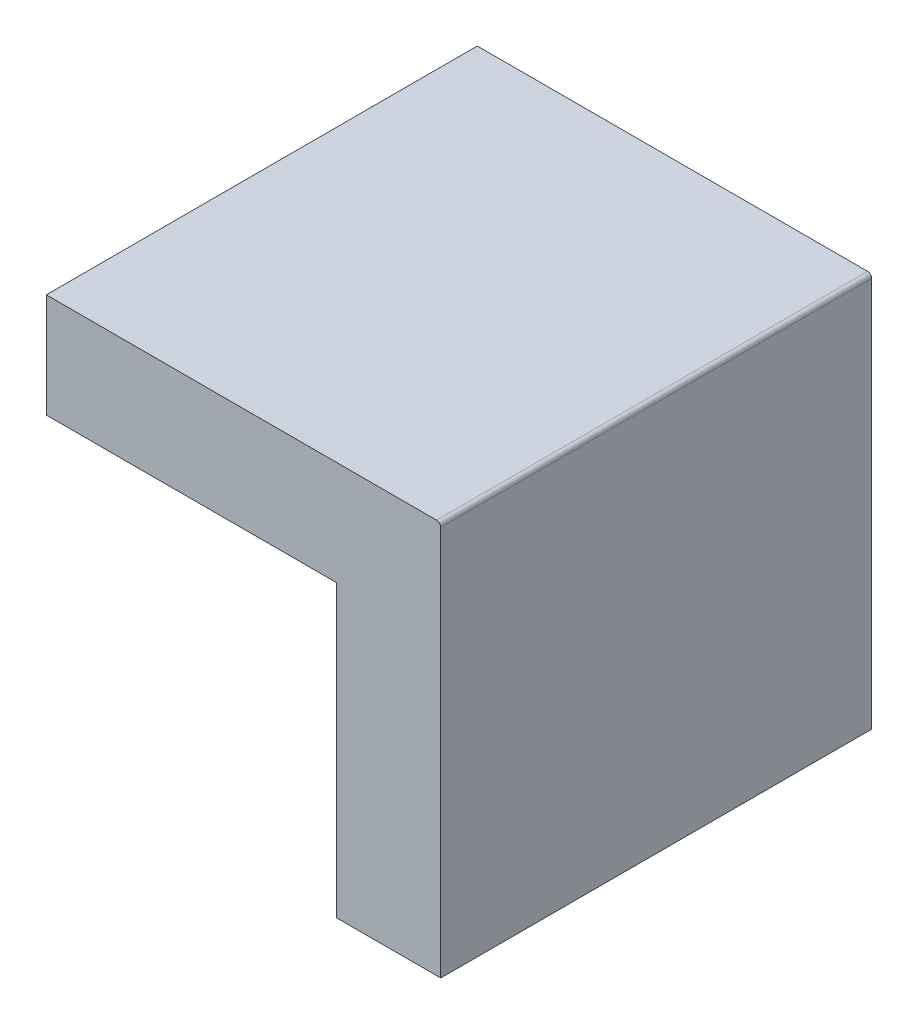
ISO-10303-21;
HEADER;
FILE_DESCRIPTION(('STEP AP214'),'2;1');
FILE_NAME('part.step','',(''),(''),'','','');
FILE_SCHEMA(('AUTOMOTIVE_DESIGN { 1 0 10303 214 1 1 1 1 }'));
ENDSEC;
DATA;
#1=APPLICATION_CONTEXT('core data for automotive mechanical design processes');
#2=APPLICATION_PROTOCOL_DEFINITION('international standard','automotive_design',2000,#1);
#3=PRODUCT_CONTEXT('',#1,'mechanical');
#4=PRODUCT('Part','Part','',(#3));
#5=PRODUCT_RELATED_PRODUCT_CATEGORY('part','',(#4));
#6=PRODUCT_DEFINITION_FORMATION('','',#4);
#7=PRODUCT_DEFINITION_CONTEXT('part definition',#1,'design');
#8=PRODUCT_DEFINITION('design','',#6,#7);
#9=PRODUCT_DEFINITION_SHAPE('','',#8);
#10=(LENGTH_UNIT() NAMED_UNIT(*) SI_UNIT(.MILLI.,.METRE.));
#11=(NAMED_UNIT(*) PLANE_ANGLE_UNIT() SI_UNIT($,.RADIAN.));
#12=(NAMED_UNIT(*) SI_UNIT($,.STERADIAN.) SOLID_ANGLE_UNIT());
#13=UNCERTAINTY_MEASURE_WITH_UNIT(LENGTH_MEASURE(1.E-05),#10,'distance_accuracy_value','');
#14=(GEOMETRIC_REPRESENTATION_CONTEXT(3) GLOBAL_UNCERTAINTY_ASSIGNED_CONTEXT((#13)) GLOBAL_UNIT_ASSIGNED_CONTEXT((#10,
#11,#12)) REPRESENTATION_CONTEXT('',''));
#15=CARTESIAN_POINT('',(0.,0.,0.));
#16=DIRECTION('',(0.,0.,1.));
#17=DIRECTION('',(1.,0.,0.));
#18=AXIS2_PLACEMENT_3D('',#15,#16,#17);
#19=CARTESIAN_POINT('',(-9.52499999998822,-9.52500000000975,-2316.22726561557));
#20=DIRECTION('',(0.,0.,1.));
#21=DIRECTION('',(1.,0.,0.));
#22=AXIS2_PLACEMENT_3D('',#19,#20,#21);
#23=CYLINDRICAL_SURFACE('',#22,9.52499999999417);
#24=CARTESIAN_POINT('',(-9.52499999998822,-9.52500000000975,-704.800000000001));
#25=DIRECTION('',(0.,0.,1.));
#26=DIRECTION('',(1.,0.,0.));
#27=AXIS2_PLACEMENT_3D('',#24,#25,#26);
#28=CIRCLE('',#27,9.52499999999417);
#29=CARTESIAN_POINT('',(-9.52499999998822,1.00369057376956E-13,-704.800000000001));
#30=VERTEX_POINT('',#29);
#31=CARTESIAN_POINT('',(5.94836679912447E-12,-9.52500000000975,-704.800000000001));
#32=VERTEX_POINT('',#31);
#33=EDGE_CURVE('E12',#30,#32,#28,.F.);
#34=ORIENTED_EDGE('',*,*,#33,.F.);
#35=DIRECTION('',(0.,0.,1.));
#36=VECTOR('',#35,1.);
#37=CARTESIAN_POINT('',(-9.52499999998822,1.00369057376956E-13,-2316.22726561557));
#38=LINE('',#37,#36);
#39=CARTESIAN_POINT('',(-9.52499999998822,1.00369057376956E-13,304.8));
#40=VERTEX_POINT('',#39);
#41=EDGE_CURVE('E228',#30,#40,#38,.T.);
#42=ORIENTED_EDGE('',*,*,#41,.T.);
#43=CARTESIAN_POINT('',(-9.52499999998822,-9.52500000000975,304.799999999999));
#44=DIRECTION('',(0.,0.,1.));
#45=DIRECTION('',(1.,0.,0.));
#46=AXIS2_PLACEMENT_3D('',#43,#44,#45);
#47=CIRCLE('',#46,9.52499999999417);
#48=CARTESIAN_POINT('',(0.,-9.52500000000911,304.8));
#49=VERTEX_POINT('',#48);
#50=EDGE_CURVE('E207',#49,#40,#47,.T.);
#51=ORIENTED_EDGE('',*,*,#50,.F.);
#52=DIRECTION('',(0.,0.,1.));
#53=VECTOR('',#52,1.);
#54=CARTESIAN_POINT('',(0.,-9.52500000000911,-2316.22726561557));
#55=LINE('',#54,#53);
#56=EDGE_CURVE('E193',#32,#49,#55,.T.);
#57=ORIENTED_EDGE('',*,*,#56,.F.);
#58=EDGE_LOOP('',(#34,#42,#51,#57));
#59=FACE_BOUND('',#58,.T.);
#60=ADVANCED_FACE('F119',(#59),#23,.T.);
#61=CARTESIAN_POINT('',(-120.,-6.35602681597902E-12,304.799999999999));
#62=DIRECTION('',(0.,0.,1.));
#63=DIRECTION('',(1.,0.,0.));
#64=AXIS2_PLACEMENT_3D('',#61,#62,#63);
#65=PLANE('',#64);
#66=DIRECTION('',(0.,-1.,0.));
#67=VECTOR('',#66,1.);
#68=CARTESIAN_POINT('',(0.,0.,304.799999999999));
#69=LINE('',#68,#67);
#70=CARTESIAN_POINT('',(0.,-923.925000000009,304.799999999999));
#71=VERTEX_POINT('',#70);
#72=EDGE_CURVE('E210',#49,#71,#69,.T.);
#73=ORIENTED_EDGE('',*,*,#72,.F.);
#74=ORIENTED_EDGE('',*,*,#50,.T.);
#75=DIRECTION('',(-1.,0.,0.));
#76=VECTOR('',#75,1.);
#77=CARTESIAN_POINT('',(0.,0.,304.799999999999));
#78=LINE('',#77,#76);
#79=CARTESIAN_POINT('',(-923.924999999988,9.7357985655766E-12,304.8));
#80=VERTEX_POINT('',#79);
#81=EDGE_CURVE('E204',#40,#80,#78,.T.);
#82=ORIENTED_EDGE('',*,*,#81,.T.);
#83=DIRECTION('',(0.,-1.,0.));
#84=VECTOR('',#83,1.);
#85=CARTESIAN_POINT('',(-923.924999999988,-4.20501222808948E-13,304.799999999999));
#86=LINE('',#85,#84);
#87=CARTESIAN_POINT('',(-923.924999999988,-243.938127260294,304.8));
#88=VERTEX_POINT('',#87);
#89=EDGE_CURVE('E200',#80,#88,#86,.T.);
#90=ORIENTED_EDGE('',*,*,#89,.T.);
#91=DIRECTION('',(1.,0.,0.));
#92=VECTOR('',#91,1.);
#93=CARTESIAN_POINT('',(0.,-243.938127260294,304.799999999999));
#94=LINE('',#93,#92);
#95=CARTESIAN_POINT('',(-243.938127260294,-243.938127260294,304.8));
#96=VERTEX_POINT('',#95);
#97=EDGE_CURVE('E198',#88,#96,#94,.T.);
#98=ORIENTED_EDGE('',*,*,#97,.T.);
#99=DIRECTION('',(0.,-1.,0.));
#100=VECTOR('',#99,1.);
#101=CARTESIAN_POINT('',(-243.938127260294,0.,304.799999999999));
#102=LINE('',#101,#100);
#103=CARTESIAN_POINT('',(-243.938127260294,-923.925000000009,304.8));
#104=VERTEX_POINT('',#103);
#105=EDGE_CURVE('E180',#96,#104,#102,.T.);
#106=ORIENTED_EDGE('',*,*,#105,.T.);
#107=DIRECTION('',(1.,0.,0.));
#108=VECTOR('',#107,1.);
#109=CARTESIAN_POINT('',(0.,-923.925000000009,304.799999999999));
#110=LINE('',#109,#108);
#111=EDGE_CURVE('E187',#104,#71,#110,.T.);
#112=ORIENTED_EDGE('',*,*,#111,.T.);
#113=EDGE_LOOP('',(#73,#74,#82,#90,#98,#106,#112));
#114=FACE_BOUND('',#113,.T.);
#115=ADVANCED_FACE('F195',(#114),#65,.T.);
#116=CARTESIAN_POINT('',(0.,0.,-2316.22726561557));
#117=DIRECTION('',(0.,1.,0.));
#118=DIRECTION('',(-1.,0.,0.));
#119=AXIS2_PLACEMENT_3D('',#116,#117,#118);
#120=PLANE('',#119);
#121=DIRECTION('',(1.,0.,0.));
#122=VECTOR('',#121,1.);
#123=CARTESIAN_POINT('',(0.,0.,-704.800000000001));
#124=LINE('',#123,#122);
#125=CARTESIAN_POINT('',(-923.924999999988,9.7357985655766E-12,-704.800000000001));
#126=VERTEX_POINT('',#125);
#127=EDGE_CURVE('E212',#126,#30,#124,.T.);
#128=ORIENTED_EDGE('',*,*,#127,.F.);
#129=DIRECTION('',(0.,0.,1.));
#130=VECTOR('',#129,1.);
#131=CARTESIAN_POINT('',(-923.924999999988,9.7357985655766E-12,-2316.22726561557));
#132=LINE('',#131,#130);
#133=EDGE_CURVE('E226',#126,#80,#132,.T.);
#134=ORIENTED_EDGE('',*,*,#133,.T.);
#135=ORIENTED_EDGE('',*,*,#81,.F.);
#136=ORIENTED_EDGE('',*,*,#41,.F.);
#137=EDGE_LOOP('',(#128,#134,#135,#136));
#138=FACE_BOUND('',#137,.T.);
#139=ADVANCED_FACE('F239',(#138),#120,.T.);
#140=CARTESIAN_POINT('',(-923.924999999988,-4.20501222808948E-13,-2316.22726561557));
#141=DIRECTION('',(-1.,0.,0.));
#142=DIRECTION('',(0.,-1.,0.));
#143=AXIS2_PLACEMENT_3D('',#140,#141,#142);
#144=PLANE('',#143);
#145=DIRECTION('',(0.,1.,0.));
#146=VECTOR('',#145,1.);
#147=CARTESIAN_POINT('',(-923.924999999988,-4.20501222808948E-13,-704.800000000001));
#148=LINE('',#147,#146);
#149=CARTESIAN_POINT('',(-923.924999999988,-243.938127260294,-704.800000000001));
#150=VERTEX_POINT('',#149);
#151=EDGE_CURVE('E214',#150,#126,#148,.T.);
#152=ORIENTED_EDGE('',*,*,#151,.F.);
#153=DIRECTION('',(0.,0.,1.));
#154=VECTOR('',#153,1.);
#155=CARTESIAN_POINT('',(-923.924999999988,-243.938127260294,-2316.22726561557));
#156=LINE('',#155,#154);
#157=EDGE_CURVE('E224',#150,#88,#156,.T.);
#158=ORIENTED_EDGE('',*,*,#157,.T.);
#159=ORIENTED_EDGE('',*,*,#89,.F.);
#160=ORIENTED_EDGE('',*,*,#133,.F.);
#161=EDGE_LOOP('',(#152,#158,#159,#160));
#162=FACE_BOUND('',#161,.T.);
#163=ADVANCED_FACE('F243',(#162),#144,.T.);
#164=CARTESIAN_POINT('',(0.,-243.938127260294,-2316.22726561557));
#165=DIRECTION('',(0.,-1.,0.));
#166=DIRECTION('',(0.,0.,-1.));
#167=AXIS2_PLACEMENT_3D('',#164,#165,#166);
#168=PLANE('',#167);
#169=DIRECTION('',(-1.,0.,0.));
#170=VECTOR('',#169,1.);
#171=CARTESIAN_POINT('',(0.,-243.938127260294,-704.800000000001));
#172=LINE('',#171,#170);
#173=CARTESIAN_POINT('',(-243.938127260294,-243.938127260294,-704.800000000001));
#174=VERTEX_POINT('',#173);
#175=EDGE_CURVE('E216',#174,#150,#172,.T.);
#176=ORIENTED_EDGE('',*,*,#175,.F.);
#177=DIRECTION('',(0.,0.,1.));
#178=VECTOR('',#177,1.);
#179=CARTESIAN_POINT('',(-243.938127260294,-243.938127260294,-2316.22726561557));
#180=LINE('',#179,#178);
#181=EDGE_CURVE('E184',#174,#96,#180,.T.);
#182=ORIENTED_EDGE('',*,*,#181,.T.);
#183=ORIENTED_EDGE('',*,*,#97,.F.);
#184=ORIENTED_EDGE('',*,*,#157,.F.);
#185=EDGE_LOOP('',(#176,#182,#183,#184));
#186=FACE_BOUND('',#185,.T.);
#187=ADVANCED_FACE('F246',(#186),#168,.T.);
#188=CARTESIAN_POINT('',(-243.938127260294,0.,-2316.22726561557));
#189=DIRECTION('',(-1.,0.,0.));
#190=DIRECTION('',(0.,-1.,0.));
#191=AXIS2_PLACEMENT_3D('',#188,#189,#190);
#192=PLANE('',#191);
#193=DIRECTION('',(0.,1.,0.));
#194=VECTOR('',#193,1.);
#195=CARTESIAN_POINT('',(-243.938127260294,0.,-704.800000000001));
#196=LINE('',#195,#194);
#197=CARTESIAN_POINT('',(-243.938127260294,-923.925000000009,-704.800000000001));
#198=VERTEX_POINT('',#197);
#199=EDGE_CURVE('E138',#198,#174,#196,.T.);
#200=ORIENTED_EDGE('',*,*,#199,.F.);
#201=DIRECTION('',(0.,0.,1.));
#202=VECTOR('',#201,1.);
#203=CARTESIAN_POINT('',(-243.938127260294,-923.925000000009,-2316.22726561557));
#204=LINE('',#203,#202);
#205=EDGE_CURVE('E175',#198,#104,#204,.T.);
#206=ORIENTED_EDGE('',*,*,#205,.T.);
#207=ORIENTED_EDGE('',*,*,#105,.F.);
#208=ORIENTED_EDGE('',*,*,#181,.F.);
#209=EDGE_LOOP('',(#200,#206,#207,#208));
#210=FACE_BOUND('',#209,.T.);
#211=ADVANCED_FACE('F177',(#210),#192,.T.);
#212=CARTESIAN_POINT('',(0.,-923.925000000009,-2316.22726561557));
#213=DIRECTION('',(0.,-1.,0.));
#214=DIRECTION('',(0.,0.,-1.));
#215=AXIS2_PLACEMENT_3D('',#212,#213,#214);
#216=PLANE('',#215);
#217=DIRECTION('',(-1.,0.,0.));
#218=VECTOR('',#217,1.);
#219=CARTESIAN_POINT('',(0.,-923.925000000009,-704.800000000001));
#220=LINE('',#219,#218);
#221=CARTESIAN_POINT('',(0.,-923.925000000009,-704.800000000001));
#222=VERTEX_POINT('',#221);
#223=EDGE_CURVE('E134',#222,#198,#220,.T.);
#224=ORIENTED_EDGE('',*,*,#223,.F.);
#225=DIRECTION('',(0.,0.,1.));
#226=VECTOR('',#225,1.);
#227=CARTESIAN_POINT('',(0.,-923.925000000009,-2316.22726561557));
#228=LINE('',#227,#226);
#229=EDGE_CURVE('E183',#222,#71,#228,.T.);
#230=ORIENTED_EDGE('',*,*,#229,.T.);
#231=ORIENTED_EDGE('',*,*,#111,.F.);
#232=ORIENTED_EDGE('',*,*,#205,.F.);
#233=EDGE_LOOP('',(#224,#230,#231,#232));
#234=FACE_BOUND('',#233,.T.);
#235=ADVANCED_FACE('F188',(#234),#216,.T.);
#236=CARTESIAN_POINT('',(0.,0.,-2316.22726561557));
#237=DIRECTION('',(-1.,0.,0.));
#238=DIRECTION('',(0.,-1.,0.));
#239=AXIS2_PLACEMENT_3D('',#236,#237,#238);
#240=PLANE('',#239);
#241=ORIENTED_EDGE('',*,*,#229,.F.);
#242=DIRECTION('',(0.,1.,0.));
#243=VECTOR('',#242,1.);
#244=CARTESIAN_POINT('',(0.,0.,-704.800000000001));
#245=LINE('',#244,#243);
#246=EDGE_CURVE('E127',#222,#32,#245,.T.);
#247=ORIENTED_EDGE('',*,*,#246,.T.);
#248=ORIENTED_EDGE('',*,*,#56,.T.);
#249=ORIENTED_EDGE('',*,*,#72,.T.);
#250=EDGE_LOOP('',(#241,#247,#248,#249));
#251=FACE_BOUND('',#250,.T.);
#252=ADVANCED_FACE('F121',(#251),#240,.F.);
#253=CARTESIAN_POINT('',(-5.34294830600857E-13,-5.64825963778048E-12,-704.800000000001));
#254=DIRECTION('',(0.,0.,1.));
#255=DIRECTION('',(1.,0.,0.));
#256=AXIS2_PLACEMENT_3D('',#253,#254,#255);
#257=PLANE('',#256);
#258=ORIENTED_EDGE('',*,*,#223,.T.);
#259=ORIENTED_EDGE('',*,*,#199,.T.);
#260=ORIENTED_EDGE('',*,*,#175,.T.);
#261=ORIENTED_EDGE('',*,*,#151,.T.);
#262=ORIENTED_EDGE('',*,*,#127,.T.);
#263=ORIENTED_EDGE('',*,*,#33,.T.);
#264=ORIENTED_EDGE('',*,*,#246,.F.);
#265=EDGE_LOOP('',(#258,#259,#260,#261,#262,#263,#264));
#266=FACE_BOUND('',#265,.T.);
#267=ADVANCED_FACE('F247',(#266),#257,.F.);
#268=CLOSED_SHELL('',(#60,#115,#139,#163,#187,#211,#235,#252,#267));
#269=MANIFOLD_SOLID_BREP('B2',#268);
#270=ADVANCED_BREP_SHAPE_REPRESENTATION('',(#18,#269),#14);
#271=SHAPE_DEFINITION_REPRESENTATION(#9,#270);
ENDSEC;
END-ISO-10303-21;
